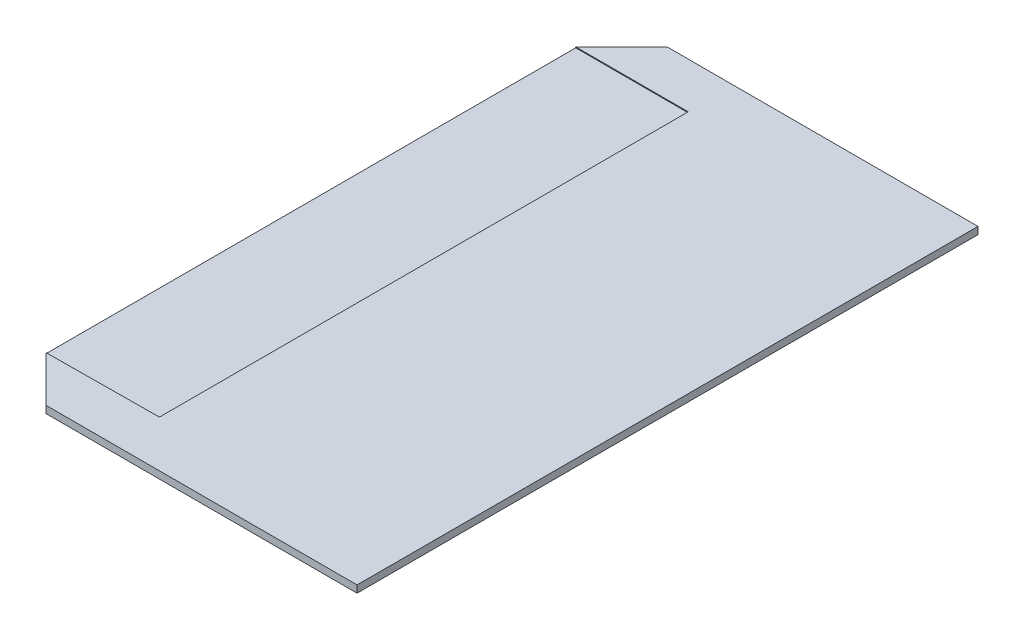
ISO-10303-21;
HEADER;
FILE_DESCRIPTION(('STEP AP214'),'2;1');
FILE_NAME('part.step','',(''),(''),'','','');
FILE_SCHEMA(('AUTOMOTIVE_DESIGN { 1 0 10303 214 1 1 1 1 }'));
ENDSEC;
DATA;
#1=APPLICATION_CONTEXT('core data for automotive mechanical design processes');
#2=APPLICATION_PROTOCOL_DEFINITION('international standard','automotive_design',2000,#1);
#3=PRODUCT_CONTEXT('',#1,'mechanical');
#4=PRODUCT('Part','Part','',(#3));
#5=PRODUCT_RELATED_PRODUCT_CATEGORY('part','',(#4));
#6=PRODUCT_DEFINITION_FORMATION('','',#4);
#7=PRODUCT_DEFINITION_CONTEXT('part definition',#1,'design');
#8=PRODUCT_DEFINITION('design','',#6,#7);
#9=PRODUCT_DEFINITION_SHAPE('','',#8);
#10=(LENGTH_UNIT() NAMED_UNIT(*) SI_UNIT(.MILLI.,.METRE.));
#11=(NAMED_UNIT(*) PLANE_ANGLE_UNIT() SI_UNIT($,.RADIAN.));
#12=(NAMED_UNIT(*) SI_UNIT($,.STERADIAN.) SOLID_ANGLE_UNIT());
#13=UNCERTAINTY_MEASURE_WITH_UNIT(LENGTH_MEASURE(1.E-05),#10,'distance_accuracy_value','');
#14=(GEOMETRIC_REPRESENTATION_CONTEXT(3) GLOBAL_UNCERTAINTY_ASSIGNED_CONTEXT((#13)) GLOBAL_UNIT_ASSIGNED_CONTEXT((#10,
#11,#12)) REPRESENTATION_CONTEXT('',''));
#15=CARTESIAN_POINT('',(0.,0.,0.));
#16=DIRECTION('',(0.,0.,1.));
#17=DIRECTION('',(1.,0.,0.));
#18=AXIS2_PLACEMENT_3D('',#15,#16,#17);
#19=CARTESIAN_POINT('',(-12.528905151,-12.283983228,0.));
#20=DIRECTION('',(0.,-1.,0.));
#21=DIRECTION('',(1.,0.,0.));
#22=AXIS2_PLACEMENT_3D('',#19,#20,#21);
#23=PLANE('',#22);
#24=DIRECTION('',(-1.,0.,0.));
#25=VECTOR('',#24,1.);
#26=CARTESIAN_POINT('',(9.861194849,-12.283983228,0.));
#27=LINE('',#26,#25);
#28=CARTESIAN_POINT('',(27.171294849,-12.283983228,0.));
#29=VERTEX_POINT('',#28);
#30=CARTESIAN_POINT('',(-7.44890515202235,-12.283983228,0.));
#31=VERTEX_POINT('',#30);
#32=EDGE_CURVE('E92',#29,#31,#27,.T.);
#33=ORIENTED_EDGE('',*,*,#32,.T.);
#34=DIRECTION('',(-0.707106781186547,0.,0.707106781186548));
#35=VECTOR('',#34,1.);
#36=CARTESIAN_POINT('',(-9.988905151,-12.283983228,2.54));
#37=LINE('',#36,#35);
#38=CARTESIAN_POINT('',(-12.528905151,-12.283983228,5.08000000297815));
#39=VERTEX_POINT('',#38);
#40=EDGE_CURVE('E88',#31,#39,#37,.T.);
#41=ORIENTED_EDGE('',*,*,#40,.T.);
#42=DIRECTION('',(1.,0.,0.));
#43=VECTOR('',#42,1.);
#44=CARTESIAN_POINT('',(-6.2644525755,-12.283983228,5.08));
#45=LINE('',#44,#43);
#46=CARTESIAN_POINT('',(4.57305157283705E-09,-12.283983228,5.08000000297815));
#47=VERTEX_POINT('',#46);
#48=EDGE_CURVE('E107',#39,#47,#45,.T.);
#49=ORIENTED_EDGE('',*,*,#48,.T.);
#50=DIRECTION('',(0.,0.,1.));
#51=VECTOR('',#50,1.);
#52=CARTESIAN_POINT('',(0.,-12.283983228,34.5087048865));
#53=LINE('',#52,#51);
#54=CARTESIAN_POINT('',(4.57305178967748E-09,-12.283983228,63.9374097720238));
#55=VERTEX_POINT('',#54);
#56=EDGE_CURVE('E121',#47,#55,#53,.T.);
#57=ORIENTED_EDGE('',*,*,#56,.T.);
#58=DIRECTION('',(-0.999970651988541,0.,0.00766127676128692));
#59=VECTOR('',#58,1.);
#60=CARTESIAN_POINT('',(-6.2644525755,-12.283983228,63.9854048865));
#61=LINE('',#60,#59);
#62=CARTESIAN_POINT('',(-12.5289051424264,-12.283983228,64.0334000055954));
#63=VERTEX_POINT('',#62);
#64=EDGE_CURVE('E115',#55,#63,#61,.T.);
#65=ORIENTED_EDGE('',*,*,#64,.T.);
#66=DIRECTION('',(0.707106781186547,0.,0.707106781186548));
#67=VECTOR('',#66,1.);
#68=CARTESIAN_POINT('',(-9.988905151,-12.283983228,66.5734));
#69=LINE('',#68,#67);
#70=CARTESIAN_POINT('',(-7.4489051530447,-12.283983228,69.1134));
#71=VERTEX_POINT('',#70);
#72=EDGE_CURVE('E139',#63,#71,#69,.T.);
#73=ORIENTED_EDGE('',*,*,#72,.T.);
#74=DIRECTION('',(-1.,0.,0.));
#75=VECTOR('',#74,1.);
#76=CARTESIAN_POINT('',(9.861194849,-12.283983228,69.1134));
#77=LINE('',#76,#75);
#78=CARTESIAN_POINT('',(27.171294849,-12.283983228,69.1134));
#79=VERTEX_POINT('',#78);
#80=EDGE_CURVE('E136',#79,#71,#77,.T.);
#81=ORIENTED_EDGE('',*,*,#80,.F.);
#82=DIRECTION('',(0.,0.,-1.));
#83=VECTOR('',#82,1.);
#84=CARTESIAN_POINT('',(27.171294849,-12.283983228,34.5567));
#85=LINE('',#84,#83);
#86=EDGE_CURVE('E140',#79,#29,#85,.T.);
#87=ORIENTED_EDGE('',*,*,#86,.T.);
#88=EDGE_LOOP('',(#33,#41,#49,#57,#65,#73,#81,#87));
#89=FACE_BOUND('',#88,.T.);
#90=ADVANCED_FACE('F15',(#89),#23,.F.);
#91=CARTESIAN_POINT('',(27.171294849,-13.083983228,0.));
#92=DIRECTION('',(-1.,0.,0.));
#93=DIRECTION('',(0.,0.,1.));
#94=AXIS2_PLACEMENT_3D('',#91,#92,#93);
#95=PLANE('',#94);
#96=DIRECTION('',(0.,1.,0.));
#97=VECTOR('',#96,1.);
#98=CARTESIAN_POINT('',(27.171294849,-12.683983228,0.));
#99=LINE('',#98,#97);
#100=CARTESIAN_POINT('',(27.171294849,-13.083983228,0.));
#101=VERTEX_POINT('',#100);
#102=EDGE_CURVE('E104',#101,#29,#99,.T.);
#103=ORIENTED_EDGE('',*,*,#102,.T.);
#104=ORIENTED_EDGE('',*,*,#86,.F.);
#105=DIRECTION('',(0.,1.,0.));
#106=VECTOR('',#105,1.);
#107=CARTESIAN_POINT('',(27.171294849,-12.683983228,69.1134));
#108=LINE('',#107,#106);
#109=CARTESIAN_POINT('',(27.171294849,-13.083983228,69.1134));
#110=VERTEX_POINT('',#109);
#111=EDGE_CURVE('E147',#110,#79,#108,.T.);
#112=ORIENTED_EDGE('',*,*,#111,.F.);
#113=DIRECTION('',(0.,0.,-1.));
#114=VECTOR('',#113,1.);
#115=CARTESIAN_POINT('',(27.171294849,-13.083983228,34.5567));
#116=LINE('',#115,#114);
#117=EDGE_CURVE('E105',#110,#101,#116,.T.);
#118=ORIENTED_EDGE('',*,*,#117,.T.);
#119=EDGE_LOOP('',(#103,#104,#112,#118));
#120=FACE_BOUND('',#119,.T.);
#121=ADVANCED_FACE('F183',(#120),#95,.F.);
#122=CARTESIAN_POINT('',(-7.448905151,-13.083983228,0.));
#123=DIRECTION('',(0.,0.,1.));
#124=DIRECTION('',(1.,0.,0.));
#125=AXIS2_PLACEMENT_3D('',#122,#123,#124);
#126=PLANE('',#125);
#127=ORIENTED_EDGE('',*,*,#102,.F.);
#128=DIRECTION('',(-1.,0.,0.));
#129=VECTOR('',#128,1.);
#130=CARTESIAN_POINT('',(7.321194849,-13.083983228,0.));
#131=LINE('',#130,#129);
#132=CARTESIAN_POINT('',(-7.448905151,-13.083983228,0.));
#133=VERTEX_POINT('',#132);
#134=EDGE_CURVE('E98',#101,#133,#131,.T.);
#135=ORIENTED_EDGE('',*,*,#134,.T.);
#136=DIRECTION('',(0.,1.,0.));
#137=VECTOR('',#136,1.);
#138=CARTESIAN_POINT('',(-7.448905151,-12.683983228,0.));
#139=LINE('',#138,#137);
#140=EDGE_CURVE('E84',#133,#31,#139,.T.);
#141=ORIENTED_EDGE('',*,*,#140,.T.);
#142=ORIENTED_EDGE('',*,*,#32,.F.);
#143=EDGE_LOOP('',(#127,#135,#141,#142));
#144=FACE_BOUND('',#143,.T.);
#145=ADVANCED_FACE('F102',(#144),#126,.F.);
#146=CARTESIAN_POINT('',(-12.528905151,-13.083983228,5.08));
#147=DIRECTION('',(0.707106781186548,0.,0.707106781186547));
#148=DIRECTION('',(0.707106781186547,0.,-0.707106781186548));
#149=AXIS2_PLACEMENT_3D('',#146,#147,#148);
#150=PLANE('',#149);
#151=DIRECTION('',(0.,1.,0.));
#152=VECTOR('',#151,1.);
#153=CARTESIAN_POINT('',(-12.528905151,-12.333983228,5.08));
#154=LINE('',#153,#152);
#155=CARTESIAN_POINT('',(-12.528905151,-12.383983228,5.08));
#156=VERTEX_POINT('',#155);
#157=EDGE_CURVE('E157',#156,#39,#154,.T.);
#158=ORIENTED_EDGE('',*,*,#157,.T.);
#159=ORIENTED_EDGE('',*,*,#40,.F.);
#160=ORIENTED_EDGE('',*,*,#140,.F.);
#161=DIRECTION('',(0.707106781186547,0.,-0.707106781186548));
#162=VECTOR('',#161,1.);
#163=CARTESIAN_POINT('',(-12.528905151,-13.083983228,5.08));
#164=LINE('',#163,#162);
#165=CARTESIAN_POINT('',(-12.528905151,-13.083983228,5.08));
#166=VERTEX_POINT('',#165);
#167=EDGE_CURVE('E19',#133,#166,#164,.F.);
#168=ORIENTED_EDGE('',*,*,#167,.T.);
#169=DIRECTION('',(0.,-1.,0.));
#170=VECTOR('',#169,1.);
#171=CARTESIAN_POINT('',(-12.528905151,-12.683983228,5.08));
#172=LINE('',#171,#170);
#173=EDGE_CURVE('E33',#156,#166,#172,.T.);
#174=ORIENTED_EDGE('',*,*,#173,.F.);
#175=EDGE_LOOP('',(#158,#159,#160,#168,#174));
#176=FACE_BOUND('',#175,.T.);
#177=ADVANCED_FACE('F86',(#176),#150,.F.);
#178=CARTESIAN_POINT('',(-7.448905151,-13.083983228,69.1134));
#179=DIRECTION('',(0.707106781186548,0.,-0.707106781186547));
#180=DIRECTION('',(-0.707106781186547,0.,-0.707106781186548));
#181=AXIS2_PLACEMENT_3D('',#178,#179,#180);
#182=PLANE('',#181);
#183=ORIENTED_EDGE('',*,*,#72,.F.);
#184=DIRECTION('',(0.,-1.,0.));
#185=VECTOR('',#184,1.);
#186=CARTESIAN_POINT('',(-12.528905151,-12.333983228,64.0334));
#187=LINE('',#186,#185);
#188=CARTESIAN_POINT('',(-12.528905151,-12.383983228,64.0333999914518));
#189=VERTEX_POINT('',#188);
#190=EDGE_CURVE('E113',#63,#189,#187,.T.);
#191=ORIENTED_EDGE('',*,*,#190,.T.);
#192=DIRECTION('',(0.,1.,0.));
#193=VECTOR('',#192,1.);
#194=CARTESIAN_POINT('',(-12.528905151,-12.683983228,64.0334));
#195=LINE('',#194,#193);
#196=CARTESIAN_POINT('',(-12.528905151,-13.083983228,64.0334));
#197=VERTEX_POINT('',#196);
#198=EDGE_CURVE('E112',#197,#189,#195,.T.);
#199=ORIENTED_EDGE('',*,*,#198,.F.);
#200=DIRECTION('',(-0.707106781186547,0.,-0.707106781186548));
#201=VECTOR('',#200,1.);
#202=CARTESIAN_POINT('',(-7.448905151,-13.083983228,69.1134));
#203=LINE('',#202,#201);
#204=CARTESIAN_POINT('',(-7.448905151,-13.083983228,69.1134));
#205=VERTEX_POINT('',#204);
#206=EDGE_CURVE('E101',#197,#205,#203,.F.);
#207=ORIENTED_EDGE('',*,*,#206,.T.);
#208=DIRECTION('',(0.,-1.,0.));
#209=VECTOR('',#208,1.);
#210=CARTESIAN_POINT('',(-7.448905151,-12.683983228,69.1134));
#211=LINE('',#210,#209);
#212=EDGE_CURVE('E116',#71,#205,#211,.T.);
#213=ORIENTED_EDGE('',*,*,#212,.F.);
#214=EDGE_LOOP('',(#183,#191,#199,#207,#213));
#215=FACE_BOUND('',#214,.T.);
#216=ADVANCED_FACE('F172',(#215),#182,.F.);
#217=CARTESIAN_POINT('',(-7.448905151,-13.083983228,69.1134));
#218=DIRECTION('',(0.,0.,1.));
#219=DIRECTION('',(1.,0.,0.));
#220=AXIS2_PLACEMENT_3D('',#217,#218,#219);
#221=PLANE('',#220);
#222=ORIENTED_EDGE('',*,*,#212,.T.);
#223=DIRECTION('',(1.,0.,0.));
#224=VECTOR('',#223,1.);
#225=CARTESIAN_POINT('',(7.321194849,-13.083983228,69.1134));
#226=LINE('',#225,#224);
#227=EDGE_CURVE('E126',#205,#110,#226,.T.);
#228=ORIENTED_EDGE('',*,*,#227,.T.);
#229=ORIENTED_EDGE('',*,*,#111,.T.);
#230=ORIENTED_EDGE('',*,*,#80,.T.);
#231=EDGE_LOOP('',(#222,#228,#229,#230));
#232=FACE_BOUND('',#231,.T.);
#233=ADVANCED_FACE('F185',(#232),#221,.T.);
#234=CARTESIAN_POINT('',(-12.528905151,-12.383983228,64.0334));
#235=DIRECTION('',(0.00766127676128692,0.,0.999970651988541));
#236=DIRECTION('',(0.999970651988541,0.,-0.00766127676128692));
#237=AXIS2_PLACEMENT_3D('',#234,#235,#236);
#238=PLANE('',#237);
#239=DIRECTION('',(0.,-1.,0.));
#240=VECTOR('',#239,1.);
#241=CARTESIAN_POINT('',(0.,-12.333983228,63.937409773));
#242=LINE('',#241,#240);
#243=CARTESIAN_POINT('',(0.,-12.383983228,63.9374097604684));
#244=VERTEX_POINT('',#243);
#245=EDGE_CURVE('E118',#55,#244,#242,.T.);
#246=ORIENTED_EDGE('',*,*,#245,.T.);
#247=DIRECTION('',(0.999970651983669,0.,-0.00766127739710183));
#248=VECTOR('',#247,1.);
#249=CARTESIAN_POINT('',(-12.528905151,-12.383983228,64.0333999829035));
#250=LINE('',#249,#248);
#251=EDGE_CURVE('E125',#189,#244,#250,.T.);
#252=ORIENTED_EDGE('',*,*,#251,.F.);
#253=ORIENTED_EDGE('',*,*,#190,.F.);
#254=ORIENTED_EDGE('',*,*,#64,.F.);
#255=EDGE_LOOP('',(#246,#252,#253,#254));
#256=FACE_BOUND('',#255,.T.);
#257=ADVANCED_FACE('F174',(#256),#238,.F.);
#258=CARTESIAN_POINT('',(0.,-12.383983228,5.08));
#259=DIRECTION('',(1.,0.,0.));
#260=DIRECTION('',(0.,1.,0.));
#261=AXIS2_PLACEMENT_3D('',#258,#259,#260);
#262=PLANE('',#261);
#263=DIRECTION('',(0.,-1.,0.));
#264=VECTOR('',#263,1.);
#265=CARTESIAN_POINT('',(0.,-12.333983228,5.08));
#266=LINE('',#265,#264);
#267=CARTESIAN_POINT('',(0.,-12.383983228,5.08));
#268=VERTEX_POINT('',#267);
#269=EDGE_CURVE('E154',#47,#268,#266,.T.);
#270=ORIENTED_EDGE('',*,*,#269,.T.);
#271=DIRECTION('',(0.,0.,-1.));
#272=VECTOR('',#271,1.);
#273=CARTESIAN_POINT('',(0.,-12.383983228,34.7335602));
#274=LINE('',#273,#272);
#275=EDGE_CURVE('E122',#244,#268,#274,.T.);
#276=ORIENTED_EDGE('',*,*,#275,.F.);
#277=ORIENTED_EDGE('',*,*,#245,.F.);
#278=ORIENTED_EDGE('',*,*,#56,.F.);
#279=EDGE_LOOP('',(#270,#276,#277,#278));
#280=FACE_BOUND('',#279,.T.);
#281=ADVANCED_FACE('F177',(#280),#262,.F.);
#282=CARTESIAN_POINT('',(0.,-12.383983228,5.08));
#283=DIRECTION('',(0.,0.,-1.));
#284=DIRECTION('',(-1.,0.,0.));
#285=AXIS2_PLACEMENT_3D('',#282,#283,#284);
#286=PLANE('',#285);
#287=ORIENTED_EDGE('',*,*,#157,.F.);
#288=DIRECTION('',(-1.,0.,0.));
#289=VECTOR('',#288,1.);
#290=CARTESIAN_POINT('',(-6.2644525755,-12.383983228,5.08));
#291=LINE('',#290,#289);
#292=EDGE_CURVE('E124',#268,#156,#291,.T.);
#293=ORIENTED_EDGE('',*,*,#292,.F.);
#294=ORIENTED_EDGE('',*,*,#269,.F.);
#295=ORIENTED_EDGE('',*,*,#48,.F.);
#296=EDGE_LOOP('',(#287,#293,#294,#295));
#297=FACE_BOUND('',#296,.T.);
#298=ADVANCED_FACE('F179',(#297),#286,.F.);
#299=CARTESIAN_POINT('',(27.171294849,-13.083983228,0.));
#300=DIRECTION('',(0.,1.,0.));
#301=DIRECTION('',(-1.,0.,0.));
#302=AXIS2_PLACEMENT_3D('',#299,#300,#301);
#303=PLANE('',#302);
#304=ORIENTED_EDGE('',*,*,#206,.F.);
#305=DIRECTION('',(0.,0.,-1.));
#306=VECTOR('',#305,1.);
#307=CARTESIAN_POINT('',(-12.528905151,-13.083983228,34.5567));
#308=LINE('',#307,#306);
#309=EDGE_CURVE('E25',#197,#166,#308,.T.);
#310=ORIENTED_EDGE('',*,*,#309,.T.);
#311=ORIENTED_EDGE('',*,*,#167,.F.);
#312=ORIENTED_EDGE('',*,*,#134,.F.);
#313=ORIENTED_EDGE('',*,*,#117,.F.);
#314=ORIENTED_EDGE('',*,*,#227,.F.);
#315=EDGE_LOOP('',(#304,#310,#311,#312,#313,#314));
#316=FACE_BOUND('',#315,.T.);
#317=ADVANCED_FACE('F97',(#316),#303,.F.);
#318=CARTESIAN_POINT('',(0.,-12.383983228,5.08));
#319=DIRECTION('',(0.,1.,0.));
#320=DIRECTION('',(-1.,0.,0.));
#321=AXIS2_PLACEMENT_3D('',#318,#319,#320);
#322=PLANE('',#321);
#323=ORIENTED_EDGE('',*,*,#275,.T.);
#324=ORIENTED_EDGE('',*,*,#292,.T.);
#325=DIRECTION('',(0.,0.,1.));
#326=VECTOR('',#325,1.);
#327=CARTESIAN_POINT('',(-12.528905151,-12.383983228,34.5567));
#328=LINE('',#327,#326);
#329=EDGE_CURVE('E10',#156,#189,#328,.T.);
#330=ORIENTED_EDGE('',*,*,#329,.T.);
#331=ORIENTED_EDGE('',*,*,#251,.T.);
#332=EDGE_LOOP('',(#323,#324,#330,#331));
#333=FACE_BOUND('',#332,.T.);
#334=ADVANCED_FACE('F165',(#333),#322,.T.);
#335=CARTESIAN_POINT('',(-12.528905151,-13.083983228,64.0334));
#336=DIRECTION('',(1.,0.,0.));
#337=DIRECTION('',(0.,0.,-1.));
#338=AXIS2_PLACEMENT_3D('',#335,#336,#337);
#339=PLANE('',#338);
#340=ORIENTED_EDGE('',*,*,#173,.T.);
#341=ORIENTED_EDGE('',*,*,#309,.F.);
#342=ORIENTED_EDGE('',*,*,#198,.T.);
#343=ORIENTED_EDGE('',*,*,#329,.F.);
#344=EDGE_LOOP('',(#340,#341,#342,#343));
#345=FACE_BOUND('',#344,.T.);
#346=ADVANCED_FACE('F17',(#345),#339,.F.);
#347=CLOSED_SHELL('',(#90,#121,#145,#177,#216,#233,#257,#281,#298,#317,#334,#346));
#348=MANIFOLD_SOLID_BREP('B1',#347);
#349=ADVANCED_BREP_SHAPE_REPRESENTATION('',(#18,#348),#14);
#350=SHAPE_DEFINITION_REPRESENTATION(#9,#349);
ENDSEC;
END-ISO-10303-21;
